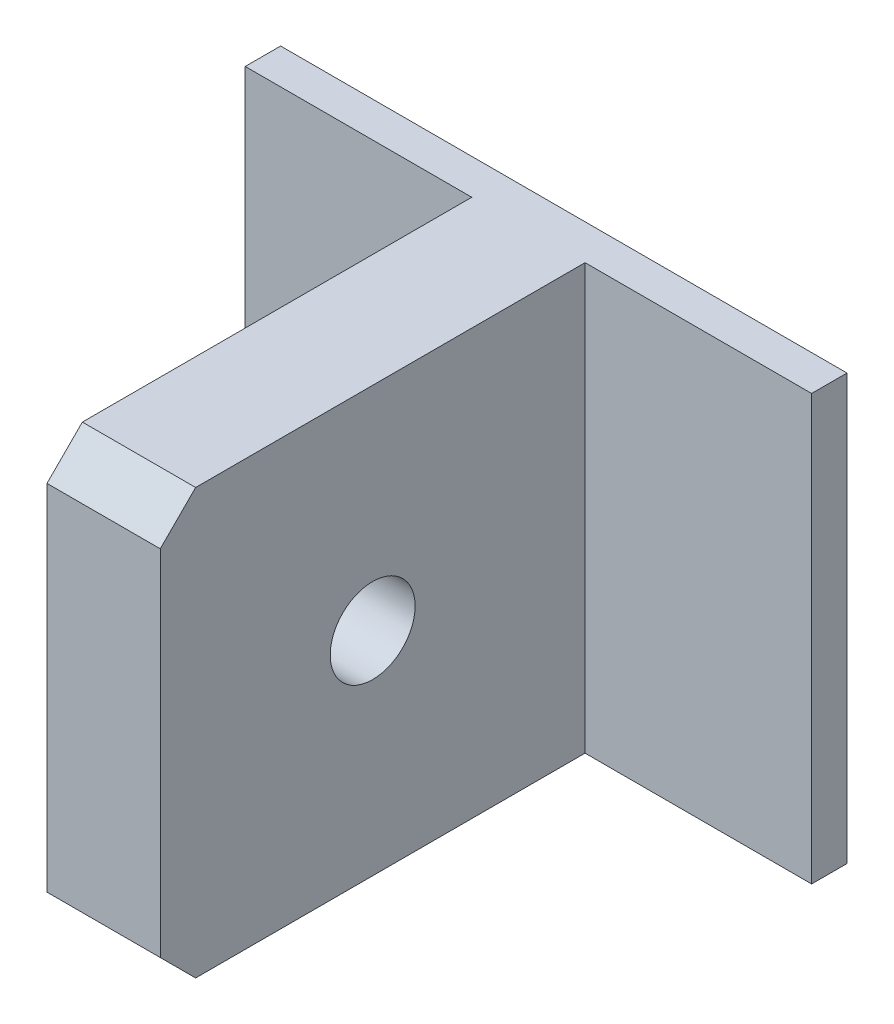
ISO-10303-21;
HEADER;
FILE_DESCRIPTION(('STEP AP214'),'2;1');
FILE_NAME('part.step','',(''),(''),'','','');
FILE_SCHEMA(('AUTOMOTIVE_DESIGN { 1 0 10303 214 1 1 1 1 }'));
ENDSEC;
DATA;
#1=APPLICATION_CONTEXT('core data for automotive mechanical design processes');
#2=APPLICATION_PROTOCOL_DEFINITION('international standard','automotive_design',2000,#1);
#3=PRODUCT_CONTEXT('',#1,'mechanical');
#4=PRODUCT('Part','Part','',(#3));
#5=PRODUCT_RELATED_PRODUCT_CATEGORY('part','',(#4));
#6=PRODUCT_DEFINITION_FORMATION('','',#4);
#7=PRODUCT_DEFINITION_CONTEXT('part definition',#1,'design');
#8=PRODUCT_DEFINITION('design','',#6,#7);
#9=PRODUCT_DEFINITION_SHAPE('','',#8);
#10=(LENGTH_UNIT() NAMED_UNIT(*) SI_UNIT(.MILLI.,.METRE.));
#11=(NAMED_UNIT(*) PLANE_ANGLE_UNIT() SI_UNIT($,.RADIAN.));
#12=(NAMED_UNIT(*) SI_UNIT($,.STERADIAN.) SOLID_ANGLE_UNIT());
#13=UNCERTAINTY_MEASURE_WITH_UNIT(LENGTH_MEASURE(1.E-05),#10,'distance_accuracy_value','');
#14=(GEOMETRIC_REPRESENTATION_CONTEXT(3) GLOBAL_UNCERTAINTY_ASSIGNED_CONTEXT((#13)) GLOBAL_UNIT_ASSIGNED_CONTEXT((#10,
#11,#12)) REPRESENTATION_CONTEXT('',''));
#15=CARTESIAN_POINT('',(0.,0.,0.));
#16=DIRECTION('',(0.,0.,1.));
#17=DIRECTION('',(1.,0.,0.));
#18=AXIS2_PLACEMENT_3D('',#15,#16,#17);
#19=CARTESIAN_POINT('',(0.,-25.,60.));
#20=DIRECTION('',(0.,0.707106781186547,-0.707106781186547));
#21=DIRECTION('',(1.,0.,0.));
#22=AXIS2_PLACEMENT_3D('',#19,#20,#21);
#23=PLANE('',#22);
#24=DIRECTION('',(1.,0.,0.));
#25=VECTOR('',#24,1.);
#26=CARTESIAN_POINT('',(0.,-25.,60.));
#27=LINE('',#26,#25);
#28=CARTESIAN_POINT('',(-8.00000000000001,-25.,60.));
#29=VERTEX_POINT('',#28);
#30=CARTESIAN_POINT('',(8.00000000000001,-25.,60.));
#31=VERTEX_POINT('',#30);
#32=EDGE_CURVE('E200',#29,#31,#27,.T.);
#33=ORIENTED_EDGE('',*,*,#32,.F.);
#34=DIRECTION('',(0.,-0.707106781186548,-0.707106781186548));
#35=VECTOR('',#34,1.);
#36=CARTESIAN_POINT('',(-8.00000000000001,-25.,60.));
#37=LINE('',#36,#35);
#38=CARTESIAN_POINT('',(-8.00000000000001,-30.,55.));
#39=VERTEX_POINT('',#38);
#40=EDGE_CURVE('E59',#39,#29,#37,.F.);
#41=ORIENTED_EDGE('',*,*,#40,.F.);
#42=DIRECTION('',(-1.,0.,0.));
#43=VECTOR('',#42,1.);
#44=CARTESIAN_POINT('',(-40.,-30.,55.));
#45=LINE('',#44,#43);
#46=CARTESIAN_POINT('',(8.00000000000001,-30.,55.));
#47=VERTEX_POINT('',#46);
#48=EDGE_CURVE('E130',#47,#39,#45,.T.);
#49=ORIENTED_EDGE('',*,*,#48,.F.);
#50=DIRECTION('',(0.,0.707106781186548,0.707106781186548));
#51=VECTOR('',#50,1.);
#52=CARTESIAN_POINT('',(8.00000000000001,-12.5,72.5));
#53=LINE('',#52,#51);
#54=EDGE_CURVE('E13',#31,#47,#53,.F.);
#55=ORIENTED_EDGE('',*,*,#54,.F.);
#56=EDGE_LOOP('',(#33,#41,#49,#55));
#57=FACE_BOUND('',#56,.T.);
#58=ADVANCED_FACE('F51',(#57),#23,.F.);
#59=CARTESIAN_POINT('',(-40.,30.,55.));
#60=DIRECTION('',(0.,0.707106781186548,0.707106781186547));
#61=DIRECTION('',(-1.,0.,0.));
#62=AXIS2_PLACEMENT_3D('',#59,#60,#61);
#63=PLANE('',#62);
#64=DIRECTION('',(1.,0.,0.));
#65=VECTOR('',#64,1.);
#66=CARTESIAN_POINT('',(-8.00000000000001,30.,55.));
#67=LINE('',#66,#65);
#68=CARTESIAN_POINT('',(-8.00000000000001,30.,55.));
#69=VERTEX_POINT('',#68);
#70=CARTESIAN_POINT('',(8.00000000000001,30.,55.));
#71=VERTEX_POINT('',#70);
#72=EDGE_CURVE('E182',#69,#71,#67,.T.);
#73=ORIENTED_EDGE('',*,*,#72,.F.);
#74=DIRECTION('',(0.,0.707106781186547,-0.707106781186548));
#75=VECTOR('',#74,1.);
#76=CARTESIAN_POINT('',(-8.00000000000001,30.,55.));
#77=LINE('',#76,#75);
#78=CARTESIAN_POINT('',(-8.00000000000001,25.,60.));
#79=VERTEX_POINT('',#78);
#80=EDGE_CURVE('E196',#79,#69,#77,.T.);
#81=ORIENTED_EDGE('',*,*,#80,.F.);
#82=DIRECTION('',(-1.,0.,0.));
#83=VECTOR('',#82,1.);
#84=CARTESIAN_POINT('',(-8.00000000000001,25.,60.));
#85=LINE('',#84,#83);
#86=CARTESIAN_POINT('',(8.00000000000001,25.,60.));
#87=VERTEX_POINT('',#86);
#88=EDGE_CURVE('E193',#87,#79,#85,.T.);
#89=ORIENTED_EDGE('',*,*,#88,.F.);
#90=DIRECTION('',(0.,-0.707106781186547,0.707106781186548));
#91=VECTOR('',#90,1.);
#92=CARTESIAN_POINT('',(8.00000000000001,12.5,72.5));
#93=LINE('',#92,#91);
#94=EDGE_CURVE('E198',#71,#87,#93,.T.);
#95=ORIENTED_EDGE('',*,*,#94,.F.);
#96=EDGE_LOOP('',(#73,#81,#89,#95));
#97=FACE_BOUND('',#96,.T.);
#98=ADVANCED_FACE('F226',(#97),#63,.T.);
#99=CARTESIAN_POINT('',(0.,0.,0.));
#100=DIRECTION('',(0.,0.,1.));
#101=DIRECTION('',(1.,0.,0.));
#102=AXIS2_PLACEMENT_3D('',#99,#100,#101);
#103=PLANE('',#102);
#104=DIRECTION('',(1.,0.,0.));
#105=VECTOR('',#104,1.);
#106=CARTESIAN_POINT('',(-40.,30.,0.));
#107=LINE('',#106,#105);
#108=CARTESIAN_POINT('',(8.00000000000001,30.,0.));
#109=VERTEX_POINT('',#108);
#110=CARTESIAN_POINT('',(40.,30.,0.));
#111=VERTEX_POINT('',#110);
#112=EDGE_CURVE('E176',#109,#111,#107,.T.);
#113=ORIENTED_EDGE('',*,*,#112,.F.);
#114=DIRECTION('',(0.,-1.,0.));
#115=VECTOR('',#114,1.);
#116=CARTESIAN_POINT('',(8.00000000000001,0.,0.));
#117=LINE('',#116,#115);
#118=CARTESIAN_POINT('',(8.00000000000001,-30.,0.));
#119=VERTEX_POINT('',#118);
#120=EDGE_CURVE('E150',#109,#119,#117,.T.);
#121=ORIENTED_EDGE('',*,*,#120,.T.);
#122=DIRECTION('',(1.,0.,0.));
#123=VECTOR('',#122,1.);
#124=CARTESIAN_POINT('',(-40.,-30.,0.));
#125=LINE('',#124,#123);
#126=CARTESIAN_POINT('',(40.,-30.,0.));
#127=VERTEX_POINT('',#126);
#128=EDGE_CURVE('E145',#119,#127,#125,.T.);
#129=ORIENTED_EDGE('',*,*,#128,.T.);
#130=DIRECTION('',(0.,1.,0.));
#131=VECTOR('',#130,1.);
#132=CARTESIAN_POINT('',(40.,-30.,0.));
#133=LINE('',#132,#131);
#134=EDGE_CURVE('E144',#127,#111,#133,.T.);
#135=ORIENTED_EDGE('',*,*,#134,.T.);
#136=EDGE_LOOP('',(#113,#121,#129,#135));
#137=FACE_BOUND('',#136,.T.);
#138=ADVANCED_FACE('F245',(#137),#103,.T.);
#139=CARTESIAN_POINT('',(-40.,-30.,-5.));
#140=DIRECTION('',(0.,-1.,0.));
#141=DIRECTION('',(0.,0.,-1.));
#142=AXIS2_PLACEMENT_3D('',#139,#140,#141);
#143=PLANE('',#142);
#144=DIRECTION('',(0.,0.,-1.));
#145=VECTOR('',#144,1.);
#146=CARTESIAN_POINT('',(8.00000000000001,-30.,60.));
#147=LINE('',#146,#145);
#148=EDGE_CURVE('E134',#47,#119,#147,.T.);
#149=ORIENTED_EDGE('',*,*,#148,.F.);
#150=ORIENTED_EDGE('',*,*,#48,.T.);
#151=DIRECTION('',(0.,0.,-1.));
#152=VECTOR('',#151,1.);
#153=CARTESIAN_POINT('',(-8.00000000000001,-30.,60.));
#154=LINE('',#153,#152);
#155=CARTESIAN_POINT('',(-8.00000000000001,-30.,0.));
#156=VERTEX_POINT('',#155);
#157=EDGE_CURVE('E125',#39,#156,#154,.T.);
#158=ORIENTED_EDGE('',*,*,#157,.T.);
#159=CARTESIAN_POINT('',(-40.,-30.,0.));
#160=VERTEX_POINT('',#159);
#161=EDGE_CURVE('E129',#160,#156,#125,.T.);
#162=ORIENTED_EDGE('',*,*,#161,.F.);
#163=DIRECTION('',(0.,0.,1.));
#164=VECTOR('',#163,1.);
#165=CARTESIAN_POINT('',(-40.,-30.,-5.));
#166=LINE('',#165,#164);
#167=CARTESIAN_POINT('',(-40.,-30.,-5.));
#168=VERTEX_POINT('',#167);
#169=EDGE_CURVE('E180',#168,#160,#166,.T.);
#170=ORIENTED_EDGE('',*,*,#169,.F.);
#171=DIRECTION('',(1.,0.,0.));
#172=VECTOR('',#171,1.);
#173=CARTESIAN_POINT('',(-40.,-30.,-5.));
#174=LINE('',#173,#172);
#175=CARTESIAN_POINT('',(40.,-30.,-5.));
#176=VERTEX_POINT('',#175);
#177=EDGE_CURVE('E163',#168,#176,#174,.T.);
#178=ORIENTED_EDGE('',*,*,#177,.T.);
#179=DIRECTION('',(0.,0.,1.));
#180=VECTOR('',#179,1.);
#181=CARTESIAN_POINT('',(40.,-30.,-5.));
#182=LINE('',#181,#180);
#183=EDGE_CURVE('E172',#176,#127,#182,.T.);
#184=ORIENTED_EDGE('',*,*,#183,.T.);
#185=ORIENTED_EDGE('',*,*,#128,.F.);
#186=EDGE_LOOP('',(#149,#150,#158,#162,#170,#178,#184,#185));
#187=FACE_BOUND('',#186,.T.);
#188=ADVANCED_FACE('F128',(#187),#143,.T.);
#189=CARTESIAN_POINT('',(-40.,-30.,-5.));
#190=DIRECTION('',(1.,0.,0.));
#191=DIRECTION('',(0.,0.,-1.));
#192=AXIS2_PLACEMENT_3D('',#189,#190,#191);
#193=PLANE('',#192);
#194=DIRECTION('',(0.,1.,0.));
#195=VECTOR('',#194,1.);
#196=CARTESIAN_POINT('',(-40.,-30.,0.));
#197=LINE('',#196,#195);
#198=CARTESIAN_POINT('',(-40.,30.,0.));
#199=VERTEX_POINT('',#198);
#200=EDGE_CURVE('E143',#160,#199,#197,.T.);
#201=ORIENTED_EDGE('',*,*,#200,.T.);
#202=DIRECTION('',(0.,0.,1.));
#203=VECTOR('',#202,1.);
#204=CARTESIAN_POINT('',(-40.,30.,-5.));
#205=LINE('',#204,#203);
#206=CARTESIAN_POINT('',(-40.,30.,-5.));
#207=VERTEX_POINT('',#206);
#208=EDGE_CURVE('E183',#207,#199,#205,.T.);
#209=ORIENTED_EDGE('',*,*,#208,.F.);
#210=DIRECTION('',(0.,1.,0.));
#211=VECTOR('',#210,1.);
#212=CARTESIAN_POINT('',(-40.,-30.,-5.));
#213=LINE('',#212,#211);
#214=EDGE_CURVE('E171',#168,#207,#213,.T.);
#215=ORIENTED_EDGE('',*,*,#214,.F.);
#216=ORIENTED_EDGE('',*,*,#169,.T.);
#217=EDGE_LOOP('',(#201,#209,#215,#216));
#218=FACE_BOUND('',#217,.T.);
#219=ADVANCED_FACE('F234',(#218),#193,.F.);
#220=CARTESIAN_POINT('',(-40.,30.,-5.));
#221=DIRECTION('',(0.,-1.,0.));
#222=DIRECTION('',(0.,0.,-1.));
#223=AXIS2_PLACEMENT_3D('',#220,#221,#222);
#224=PLANE('',#223);
#225=DIRECTION('',(0.,0.,-1.));
#226=VECTOR('',#225,1.);
#227=CARTESIAN_POINT('',(-8.00000000000001,30.,60.));
#228=LINE('',#227,#226);
#229=CARTESIAN_POINT('',(-8.00000000000001,30.,0.));
#230=VERTEX_POINT('',#229);
#231=EDGE_CURVE('E133',#69,#230,#228,.T.);
#232=ORIENTED_EDGE('',*,*,#231,.F.);
#233=ORIENTED_EDGE('',*,*,#72,.T.);
#234=DIRECTION('',(0.,0.,-1.));
#235=VECTOR('',#234,1.);
#236=CARTESIAN_POINT('',(8.00000000000001,30.,60.));
#237=LINE('',#236,#235);
#238=EDGE_CURVE('E161',#71,#109,#237,.T.);
#239=ORIENTED_EDGE('',*,*,#238,.T.);
#240=ORIENTED_EDGE('',*,*,#112,.T.);
#241=DIRECTION('',(0.,0.,1.));
#242=VECTOR('',#241,1.);
#243=CARTESIAN_POINT('',(40.,30.,-5.));
#244=LINE('',#243,#242);
#245=CARTESIAN_POINT('',(40.,30.,-5.));
#246=VERTEX_POINT('',#245);
#247=EDGE_CURVE('E186',#246,#111,#244,.T.);
#248=ORIENTED_EDGE('',*,*,#247,.F.);
#249=DIRECTION('',(1.,0.,0.));
#250=VECTOR('',#249,1.);
#251=CARTESIAN_POINT('',(-40.,30.,-5.));
#252=LINE('',#251,#250);
#253=EDGE_CURVE('E169',#207,#246,#252,.T.);
#254=ORIENTED_EDGE('',*,*,#253,.F.);
#255=ORIENTED_EDGE('',*,*,#208,.T.);
#256=EDGE_CURVE('E177',#199,#230,#107,.T.);
#257=ORIENTED_EDGE('',*,*,#256,.T.);
#258=EDGE_LOOP('',(#232,#233,#239,#240,#248,#254,#255,#257));
#259=FACE_BOUND('',#258,.T.);
#260=ADVANCED_FACE('F228',(#259),#224,.F.);
#261=CARTESIAN_POINT('',(40.,-30.,-5.));
#262=DIRECTION('',(1.,0.,0.));
#263=DIRECTION('',(0.,0.,-1.));
#264=AXIS2_PLACEMENT_3D('',#261,#262,#263);
#265=PLANE('',#264);
#266=ORIENTED_EDGE('',*,*,#134,.F.);
#267=ORIENTED_EDGE('',*,*,#183,.F.);
#268=DIRECTION('',(0.,1.,0.));
#269=VECTOR('',#268,1.);
#270=CARTESIAN_POINT('',(40.,-30.,-5.));
#271=LINE('',#270,#269);
#272=EDGE_CURVE('E166',#176,#246,#271,.T.);
#273=ORIENTED_EDGE('',*,*,#272,.T.);
#274=ORIENTED_EDGE('',*,*,#247,.T.);
#275=EDGE_LOOP('',(#266,#267,#273,#274));
#276=FACE_BOUND('',#275,.T.);
#277=ADVANCED_FACE('F242',(#276),#265,.T.);
#278=CARTESIAN_POINT('',(0.,0.,-5.));
#279=DIRECTION('',(0.,0.,1.));
#280=DIRECTION('',(1.,0.,0.));
#281=AXIS2_PLACEMENT_3D('',#278,#279,#280);
#282=PLANE('',#281);
#283=ORIENTED_EDGE('',*,*,#177,.F.);
#284=ORIENTED_EDGE('',*,*,#214,.T.);
#285=ORIENTED_EDGE('',*,*,#253,.T.);
#286=ORIENTED_EDGE('',*,*,#272,.F.);
#287=EDGE_LOOP('',(#283,#284,#285,#286));
#288=FACE_BOUND('',#287,.T.);
#289=ADVANCED_FACE('F240',(#288),#282,.F.);
#290=DIRECTION('',(0.,-1.,0.));
#291=VECTOR('',#290,1.);
#292=CARTESIAN_POINT('',(-8.00000000000001,0.,0.));
#293=LINE('',#292,#291);
#294=EDGE_CURVE('E141',#230,#156,#293,.T.);
#295=ORIENTED_EDGE('',*,*,#294,.F.);
#296=ORIENTED_EDGE('',*,*,#256,.F.);
#297=ORIENTED_EDGE('',*,*,#200,.F.);
#298=ORIENTED_EDGE('',*,*,#161,.T.);
#299=EDGE_LOOP('',(#295,#296,#297,#298));
#300=FACE_BOUND('',#299,.T.);
#301=ADVANCED_FACE('F139',(#300),#103,.T.);
#302=CARTESIAN_POINT('',(8.00000000000001,0.,60.));
#303=DIRECTION('',(1.,0.,0.));
#304=DIRECTION('',(0.,0.,-1.));
#305=AXIS2_PLACEMENT_3D('',#302,#303,#304);
#306=PLANE('',#305);
#307=CARTESIAN_POINT('',(8.00000000000001,0.,30.));
#308=DIRECTION('',(1.,0.,0.));
#309=DIRECTION('',(0.,0.,-1.));
#310=AXIS2_PLACEMENT_3D('',#307,#308,#309);
#311=CIRCLE('',#310,6.);
#312=CARTESIAN_POINT('',(8.00000000000001,0.,24.));
#313=VERTEX_POINT('',#312);
#314=EDGE_CURVE('E203',#313,#313,#311,.T.);
#315=ORIENTED_EDGE('',*,*,#314,.F.);
#316=EDGE_LOOP('',(#315));
#317=FACE_BOUND('',#316,.T.);
#318=DIRECTION('',(0.,-1.,0.));
#319=VECTOR('',#318,1.);
#320=CARTESIAN_POINT('',(8.00000000000001,0.,60.));
#321=LINE('',#320,#319);
#322=EDGE_CURVE('E149',#87,#31,#321,.T.);
#323=ORIENTED_EDGE('',*,*,#322,.T.);
#324=ORIENTED_EDGE('',*,*,#54,.T.);
#325=ORIENTED_EDGE('',*,*,#148,.T.);
#326=ORIENTED_EDGE('',*,*,#120,.F.);
#327=ORIENTED_EDGE('',*,*,#238,.F.);
#328=ORIENTED_EDGE('',*,*,#94,.T.);
#329=EDGE_LOOP('',(#323,#324,#325,#326,#327,#328));
#330=FACE_BOUND('',#329,.T.);
#331=ADVANCED_FACE('F219',(#317,#330),#306,.T.);
#332=CARTESIAN_POINT('',(-8.00000000000001,0.,60.));
#333=DIRECTION('',(1.,0.,0.));
#334=DIRECTION('',(0.,0.,-1.));
#335=AXIS2_PLACEMENT_3D('',#332,#333,#334);
#336=PLANE('',#335);
#337=CARTESIAN_POINT('',(-8.00000000000001,0.,30.));
#338=DIRECTION('',(1.,0.,0.));
#339=DIRECTION('',(0.,0.,-1.));
#340=AXIS2_PLACEMENT_3D('',#337,#338,#339);
#341=CIRCLE('',#340,6.);
#342=CARTESIAN_POINT('',(-8.00000000000001,0.,24.));
#343=VERTEX_POINT('',#342);
#344=EDGE_CURVE('E155',#343,#343,#341,.T.);
#345=ORIENTED_EDGE('',*,*,#344,.T.);
#346=EDGE_LOOP('',(#345));
#347=FACE_BOUND('',#346,.T.);
#348=ORIENTED_EDGE('',*,*,#157,.F.);
#349=ORIENTED_EDGE('',*,*,#40,.T.);
#350=DIRECTION('',(0.,-1.,0.));
#351=VECTOR('',#350,1.);
#352=CARTESIAN_POINT('',(-8.00000000000001,0.,60.));
#353=LINE('',#352,#351);
#354=EDGE_CURVE('E152',#79,#29,#353,.T.);
#355=ORIENTED_EDGE('',*,*,#354,.F.);
#356=ORIENTED_EDGE('',*,*,#80,.T.);
#357=ORIENTED_EDGE('',*,*,#231,.T.);
#358=ORIENTED_EDGE('',*,*,#294,.T.);
#359=EDGE_LOOP('',(#348,#349,#355,#356,#357,#358));
#360=FACE_BOUND('',#359,.T.);
#361=ADVANCED_FACE('F147',(#347,#360),#336,.F.);
#362=CARTESIAN_POINT('',(0.,0.,60.));
#363=DIRECTION('',(0.,0.,1.));
#364=DIRECTION('',(1.,0.,0.));
#365=AXIS2_PLACEMENT_3D('',#362,#363,#364);
#366=PLANE('',#365);
#367=ORIENTED_EDGE('',*,*,#354,.T.);
#368=ORIENTED_EDGE('',*,*,#32,.T.);
#369=ORIENTED_EDGE('',*,*,#322,.F.);
#370=ORIENTED_EDGE('',*,*,#88,.T.);
#371=EDGE_LOOP('',(#367,#368,#369,#370));
#372=FACE_BOUND('',#371,.T.);
#373=ADVANCED_FACE('F210',(#372),#366,.T.);
#374=CARTESIAN_POINT('',(-52.,0.,30.));
#375=DIRECTION('',(1.,0.,0.));
#376=DIRECTION('',(0.,0.,-1.));
#377=AXIS2_PLACEMENT_3D('',#374,#375,#376);
#378=CYLINDRICAL_SURFACE('',#377,6.);
#379=ORIENTED_EDGE('',*,*,#314,.T.);
#380=EDGE_LOOP('',(#379));
#381=FACE_BOUND('',#380,.T.);
#382=ORIENTED_EDGE('',*,*,#344,.F.);
#383=EDGE_LOOP('',(#382));
#384=FACE_BOUND('',#383,.T.);
#385=ADVANCED_FACE('F216',(#381,#384),#378,.F.);
#386=CLOSED_SHELL('',(#58,#98,#138,#188,#219,#260,#277,#289,#301,#331,#361,#373,#385));
#387=MANIFOLD_SOLID_BREP('B2',#386);
#388=ADVANCED_BREP_SHAPE_REPRESENTATION('',(#18,#387),#14);
#389=SHAPE_DEFINITION_REPRESENTATION(#9,#388);
ENDSEC;
END-ISO-10303-21;
